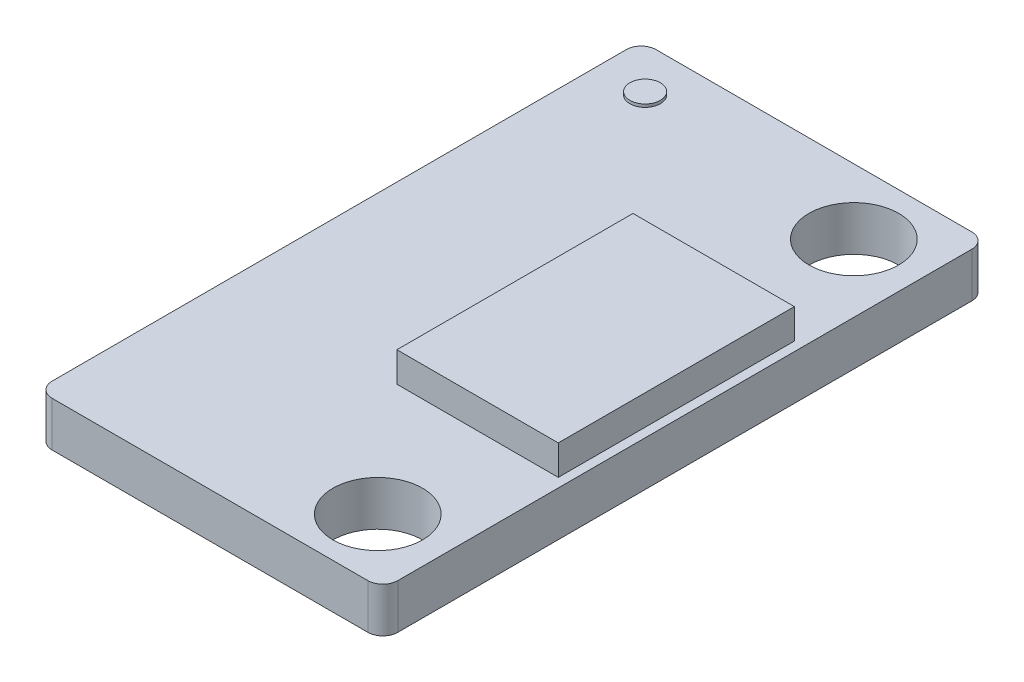
ISO-10303-21;
HEADER;
FILE_DESCRIPTION(('STEP AP214'),'2;1');
FILE_NAME('part.step','',(''),(''),'','','');
FILE_SCHEMA(('AUTOMOTIVE_DESIGN { 1 0 10303 214 1 1 1 1 }'));
ENDSEC;
DATA;
#1=APPLICATION_CONTEXT('core data for automotive mechanical design processes');
#2=APPLICATION_PROTOCOL_DEFINITION('international standard','automotive_design',2000,#1);
#3=PRODUCT_CONTEXT('',#1,'mechanical');
#4=PRODUCT('Part','Part','',(#3));
#5=PRODUCT_RELATED_PRODUCT_CATEGORY('part','',(#4));
#6=PRODUCT_DEFINITION_FORMATION('','',#4);
#7=PRODUCT_DEFINITION_CONTEXT('part definition',#1,'design');
#8=PRODUCT_DEFINITION('design','',#6,#7);
#9=PRODUCT_DEFINITION_SHAPE('','',#8);
#10=(LENGTH_UNIT() NAMED_UNIT(*) SI_UNIT(.MILLI.,.METRE.));
#11=(NAMED_UNIT(*) PLANE_ANGLE_UNIT() SI_UNIT($,.RADIAN.));
#12=(NAMED_UNIT(*) SI_UNIT($,.STERADIAN.) SOLID_ANGLE_UNIT());
#13=UNCERTAINTY_MEASURE_WITH_UNIT(LENGTH_MEASURE(1.E-05),#10,'distance_accuracy_value','');
#14=(GEOMETRIC_REPRESENTATION_CONTEXT(3) GLOBAL_UNCERTAINTY_ASSIGNED_CONTEXT((#13)) GLOBAL_UNIT_ASSIGNED_CONTEXT((#10,
#11,#12)) REPRESENTATION_CONTEXT('',''));
#15=CARTESIAN_POINT('',(0.,0.,0.));
#16=DIRECTION('',(0.,0.,1.));
#17=DIRECTION('',(1.,0.,0.));
#18=AXIS2_PLACEMENT_3D('',#15,#16,#17);
#19=CARTESIAN_POINT('',(-8.5603945745485,-1.5,-10.0844390445576));
#20=DIRECTION('',(-1.,0.,0.));
#21=DIRECTION('',(0.,0.,1.));
#22=AXIS2_PLACEMENT_3D('',#19,#20,#21);
#23=PLANE('',#22);
#24=DIRECTION('',(0.,0.,1.));
#25=VECTOR('',#24,1.);
#26=CARTESIAN_POINT('',(-8.5603945745485,0.,-10.0844390445576));
#27=LINE('',#26,#25);
#28=CARTESIAN_POINT('',(-8.5603945745485,0.,-9.58443904455764));
#29=VERTEX_POINT('',#28);
#30=CARTESIAN_POINT('',(-8.5603945745485,0.,9.62687746874085));
#31=VERTEX_POINT('',#30);
#32=EDGE_CURVE('E157',#29,#31,#27,.T.);
#33=ORIENTED_EDGE('',*,*,#32,.F.);
#34=DIRECTION('',(0.,1.,0.));
#35=VECTOR('',#34,1.);
#36=CARTESIAN_POINT('',(-8.5603945745485,-1.5,-9.58443904455764));
#37=LINE('',#36,#35);
#38=CARTESIAN_POINT('',(-8.5603945745485,-1.5,-9.58443904455764));
#39=VERTEX_POINT('',#38);
#40=EDGE_CURVE('E234',#29,#39,#37,.F.);
#41=ORIENTED_EDGE('',*,*,#40,.T.);
#42=DIRECTION('',(0.,0.,1.));
#43=VECTOR('',#42,1.);
#44=CARTESIAN_POINT('',(-8.5603945745485,-1.5,-10.0844390445576));
#45=LINE('',#44,#43);
#46=CARTESIAN_POINT('',(-8.5603945745485,-1.5,9.62687746874085));
#47=VERTEX_POINT('',#46);
#48=EDGE_CURVE('E168',#39,#47,#45,.T.);
#49=ORIENTED_EDGE('',*,*,#48,.T.);
#50=DIRECTION('',(0.,1.,0.));
#51=VECTOR('',#50,1.);
#52=CARTESIAN_POINT('',(-8.5603945745485,-1.5,9.62687746874085));
#53=LINE('',#52,#51);
#54=EDGE_CURVE('E230',#47,#31,#53,.T.);
#55=ORIENTED_EDGE('',*,*,#54,.T.);
#56=EDGE_LOOP('',(#33,#41,#49,#55));
#57=FACE_BOUND('',#56,.T.);
#58=ADVANCED_FACE('F38',(#57),#23,.T.);
#59=CARTESIAN_POINT('',(-8.5603945745485,-1.5,-10.0844390445576));
#60=DIRECTION('',(0.,0.,1.));
#61=DIRECTION('',(1.,0.,0.));
#62=AXIS2_PLACEMENT_3D('',#59,#60,#61);
#63=PLANE('',#62);
#64=DIRECTION('',(1.,0.,0.));
#65=VECTOR('',#64,1.);
#66=CARTESIAN_POINT('',(-8.5603945745485,0.,-10.0844390445576));
#67=LINE('',#66,#65);
#68=CARTESIAN_POINT('',(-8.0603945745485,0.,-10.0844390445576));
#69=VERTEX_POINT('',#68);
#70=CARTESIAN_POINT('',(2.50596611917854,0.,-10.0844390445576));
#71=VERTEX_POINT('',#70);
#72=EDGE_CURVE('E173',#69,#71,#67,.T.);
#73=ORIENTED_EDGE('',*,*,#72,.T.);
#74=DIRECTION('',(0.,1.,0.));
#75=VECTOR('',#74,1.);
#76=CARTESIAN_POINT('',(2.50596611917854,-1.5,-10.0844390445576));
#77=LINE('',#76,#75);
#78=CARTESIAN_POINT('',(2.50596611917854,-1.5,-10.0844390445576));
#79=VERTEX_POINT('',#78);
#80=EDGE_CURVE('E216',#71,#79,#77,.F.);
#81=ORIENTED_EDGE('',*,*,#80,.T.);
#82=DIRECTION('',(1.,0.,0.));
#83=VECTOR('',#82,1.);
#84=CARTESIAN_POINT('',(-8.5603945745485,-1.5,-10.0844390445576));
#85=LINE('',#84,#83);
#86=CARTESIAN_POINT('',(-8.0603945745485,-1.5,-10.0844390445576));
#87=VERTEX_POINT('',#86);
#88=EDGE_CURVE('E179',#87,#79,#85,.T.);
#89=ORIENTED_EDGE('',*,*,#88,.F.);
#90=DIRECTION('',(0.,1.,0.));
#91=VECTOR('',#90,1.);
#92=CARTESIAN_POINT('',(-8.0603945745485,0.,-10.0844390445576));
#93=LINE('',#92,#91);
#94=EDGE_CURVE('E212',#87,#69,#93,.T.);
#95=ORIENTED_EDGE('',*,*,#94,.T.);
#96=EDGE_LOOP('',(#73,#81,#89,#95));
#97=FACE_BOUND('',#96,.T.);
#98=ADVANCED_FACE('F260',(#97),#63,.F.);
#99=CARTESIAN_POINT('',(3.00596611917854,-1.5,-10.0844390445576));
#100=DIRECTION('',(-1.,0.,0.));
#101=DIRECTION('',(0.,0.,1.));
#102=AXIS2_PLACEMENT_3D('',#99,#100,#101);
#103=PLANE('',#102);
#104=DIRECTION('',(0.,0.,1.));
#105=VECTOR('',#104,1.);
#106=CARTESIAN_POINT('',(3.00596611917854,-1.5,-10.0844390445576));
#107=LINE('',#106,#105);
#108=CARTESIAN_POINT('',(3.00596611917854,-1.5,-9.58443904455764));
#109=VERTEX_POINT('',#108);
#110=CARTESIAN_POINT('',(3.00596611917854,-1.5,9.62687746874085));
#111=VERTEX_POINT('',#110);
#112=EDGE_CURVE('E176',#109,#111,#107,.T.);
#113=ORIENTED_EDGE('',*,*,#112,.F.);
#114=DIRECTION('',(0.,1.,0.));
#115=VECTOR('',#114,1.);
#116=CARTESIAN_POINT('',(3.00596611917854,-1.5,-9.58443904455764));
#117=LINE('',#116,#115);
#118=CARTESIAN_POINT('',(3.00596611917854,0.,-9.58443904455764));
#119=VERTEX_POINT('',#118);
#120=EDGE_CURVE('E196',#109,#119,#117,.T.);
#121=ORIENTED_EDGE('',*,*,#120,.T.);
#122=DIRECTION('',(0.,0.,1.));
#123=VECTOR('',#122,1.);
#124=CARTESIAN_POINT('',(3.00596611917854,0.,-10.0844390445576));
#125=LINE('',#124,#123);
#126=CARTESIAN_POINT('',(3.00596611917854,0.,9.62687746874085));
#127=VERTEX_POINT('',#126);
#128=EDGE_CURVE('E187',#119,#127,#125,.T.);
#129=ORIENTED_EDGE('',*,*,#128,.T.);
#130=DIRECTION('',(0.,1.,0.));
#131=VECTOR('',#130,1.);
#132=CARTESIAN_POINT('',(3.00596611917854,-1.5,9.62687746874085));
#133=LINE('',#132,#131);
#134=EDGE_CURVE('E182',#127,#111,#133,.F.);
#135=ORIENTED_EDGE('',*,*,#134,.T.);
#136=EDGE_LOOP('',(#113,#121,#129,#135));
#137=FACE_BOUND('',#136,.T.);
#138=ADVANCED_FACE('F268',(#137),#103,.F.);
#139=CARTESIAN_POINT('',(-8.5603945745485,-1.5,10.1268774687408));
#140=DIRECTION('',(0.,0.,1.));
#141=DIRECTION('',(1.,0.,0.));
#142=AXIS2_PLACEMENT_3D('',#139,#140,#141);
#143=PLANE('',#142);
#144=DIRECTION('',(1.,0.,0.));
#145=VECTOR('',#144,1.);
#146=CARTESIAN_POINT('',(-8.5603945745485,0.,10.1268774687408));
#147=LINE('',#146,#145);
#148=CARTESIAN_POINT('',(-8.0603945745485,0.,10.1268774687408));
#149=VERTEX_POINT('',#148);
#150=CARTESIAN_POINT('',(2.50596611917854,0.,10.1268774687408));
#151=VERTEX_POINT('',#150);
#152=EDGE_CURVE('E162',#149,#151,#147,.T.);
#153=ORIENTED_EDGE('',*,*,#152,.F.);
#154=DIRECTION('',(0.,1.,0.));
#155=VECTOR('',#154,1.);
#156=CARTESIAN_POINT('',(-8.0603945745485,-1.5,10.1268774687408));
#157=LINE('',#156,#155);
#158=CARTESIAN_POINT('',(-8.0603945745485,-1.5,10.1268774687408));
#159=VERTEX_POINT('',#158);
#160=EDGE_CURVE('E11',#149,#159,#157,.F.);
#161=ORIENTED_EDGE('',*,*,#160,.T.);
#162=DIRECTION('',(1.,0.,0.));
#163=VECTOR('',#162,1.);
#164=CARTESIAN_POINT('',(-8.5603945745485,-1.5,10.1268774687408));
#165=LINE('',#164,#163);
#166=CARTESIAN_POINT('',(2.50596611917854,-1.5,10.1268774687408));
#167=VERTEX_POINT('',#166);
#168=EDGE_CURVE('E172',#159,#167,#165,.T.);
#169=ORIENTED_EDGE('',*,*,#168,.T.);
#170=DIRECTION('',(0.,1.,0.));
#171=VECTOR('',#170,1.);
#172=CARTESIAN_POINT('',(2.50596611917854,0.,10.1268774687408));
#173=LINE('',#172,#171);
#174=EDGE_CURVE('E47',#167,#151,#173,.T.);
#175=ORIENTED_EDGE('',*,*,#174,.T.);
#176=EDGE_LOOP('',(#153,#161,#169,#175));
#177=FACE_BOUND('',#176,.T.);
#178=ADVANCED_FACE('F239',(#177),#143,.T.);
#179=CARTESIAN_POINT('',(0.,-1.5,0.));
#180=DIRECTION('',(0.,1.,0.));
#181=DIRECTION('',(0.,0.,1.));
#182=AXIS2_PLACEMENT_3D('',#179,#180,#181);
#183=PLANE('',#182);
#184=CARTESIAN_POINT('',(0.741742268013394,-1.5,-7.89949853589713));
#185=DIRECTION('',(0.,1.,0.));
#186=DIRECTION('',(0.,0.,1.));
#187=AXIS2_PLACEMENT_3D('',#184,#185,#186);
#188=CIRCLE('',#187,1.5);
#189=CARTESIAN_POINT('',(0.741742268013394,-1.5,-6.39949853589713));
#190=VERTEX_POINT('',#189);
#191=EDGE_CURVE('E437',#190,#190,#188,.T.);
#192=ORIENTED_EDGE('',*,*,#191,.T.);
#193=EDGE_LOOP('',(#192));
#194=FACE_BOUND('',#193,.T.);
#195=CARTESIAN_POINT('',(0.741742268013394,-1.5,8.03285957816409));
#196=DIRECTION('',(0.,1.,0.));
#197=DIRECTION('',(0.,0.,1.));
#198=AXIS2_PLACEMENT_3D('',#195,#196,#197);
#199=CIRCLE('',#198,1.5);
#200=CARTESIAN_POINT('',(0.741742268013394,-1.5,9.53285957816409));
#201=VERTEX_POINT('',#200);
#202=EDGE_CURVE('E440',#201,#201,#199,.T.);
#203=ORIENTED_EDGE('',*,*,#202,.T.);
#204=EDGE_LOOP('',(#203));
#205=FACE_BOUND('',#204,.T.);
#206=ORIENTED_EDGE('',*,*,#88,.T.);
#207=CARTESIAN_POINT('',(2.50596611917854,-1.5,-9.58443904455764));
#208=DIRECTION('',(0.,1.,0.));
#209=DIRECTION('',(0.,0.,1.));
#210=AXIS2_PLACEMENT_3D('',#207,#208,#209);
#211=CIRCLE('',#210,0.5);
#212=EDGE_CURVE('E227',#79,#109,#211,.F.);
#213=ORIENTED_EDGE('',*,*,#212,.T.);
#214=ORIENTED_EDGE('',*,*,#112,.T.);
#215=CARTESIAN_POINT('',(2.50596611917854,-1.5,9.62687746874085));
#216=DIRECTION('',(0.,1.,0.));
#217=DIRECTION('',(0.,0.,1.));
#218=AXIS2_PLACEMENT_3D('',#215,#216,#217);
#219=CIRCLE('',#218,0.5);
#220=EDGE_CURVE('E54',#111,#167,#219,.F.);
#221=ORIENTED_EDGE('',*,*,#220,.T.);
#222=ORIENTED_EDGE('',*,*,#168,.F.);
#223=CARTESIAN_POINT('',(-8.0603945745485,-1.5,9.62687746874085));
#224=DIRECTION('',(0.,1.,0.));
#225=DIRECTION('',(0.,0.,1.));
#226=AXIS2_PLACEMENT_3D('',#223,#224,#225);
#227=CIRCLE('',#226,0.5);
#228=EDGE_CURVE('E221',#159,#47,#227,.F.);
#229=ORIENTED_EDGE('',*,*,#228,.T.);
#230=ORIENTED_EDGE('',*,*,#48,.F.);
#231=CARTESIAN_POINT('',(-8.0603945745485,-1.5,-9.58443904455764));
#232=DIRECTION('',(0.,1.,0.));
#233=DIRECTION('',(0.,0.,1.));
#234=AXIS2_PLACEMENT_3D('',#231,#232,#233);
#235=CIRCLE('',#234,0.5);
#236=EDGE_CURVE('E224',#39,#87,#235,.F.);
#237=ORIENTED_EDGE('',*,*,#236,.T.);
#238=EDGE_LOOP('',(#206,#213,#214,#221,#222,#229,#230,#237));
#239=FACE_BOUND('',#238,.T.);
#240=ADVANCED_FACE('F253',(#194,#205,#239),#183,.F.);
#241=CARTESIAN_POINT('',(0.,0.,0.));
#242=DIRECTION('',(0.,1.,0.));
#243=DIRECTION('',(0.,0.,1.));
#244=AXIS2_PLACEMENT_3D('',#241,#242,#243);
#245=PLANE('',#244);
#246=CARTESIAN_POINT('',(0.741742268013394,0.,-7.89949853589713));
#247=DIRECTION('',(0.,1.,0.));
#248=DIRECTION('',(0.,0.,1.));
#249=AXIS2_PLACEMENT_3D('',#246,#247,#248);
#250=CIRCLE('',#249,1.5);
#251=CARTESIAN_POINT('',(0.741742268013394,0.,-6.39949853589713));
#252=VERTEX_POINT('',#251);
#253=EDGE_CURVE('E443',#252,#252,#250,.T.);
#254=ORIENTED_EDGE('',*,*,#253,.F.);
#255=EDGE_LOOP('',(#254));
#256=FACE_BOUND('',#255,.T.);
#257=CARTESIAN_POINT('',(0.741742268013394,0.,8.03285957816409));
#258=DIRECTION('',(0.,1.,0.));
#259=DIRECTION('',(0.,0.,1.));
#260=AXIS2_PLACEMENT_3D('',#257,#258,#259);
#261=CIRCLE('',#260,1.5);
#262=CARTESIAN_POINT('',(0.741742268013394,0.,9.53285957816409));
#263=VERTEX_POINT('',#262);
#264=EDGE_CURVE('E450',#263,#263,#261,.T.);
#265=ORIENTED_EDGE('',*,*,#264,.F.);
#266=EDGE_LOOP('',(#265));
#267=FACE_BOUND('',#266,.T.);
#268=CARTESIAN_POINT('',(-6.93011195325359,0.,-8.5863892127535));
#269=DIRECTION('',(0.,1.,0.));
#270=DIRECTION('',(0.,0.,1.));
#271=AXIS2_PLACEMENT_3D('',#268,#269,#270);
#272=CIRCLE('',#271,0.51);
#273=CARTESIAN_POINT('',(-6.93011195325359,0.,-8.0763892127535));
#274=VERTEX_POINT('',#273);
#275=EDGE_CURVE('E447',#274,#274,#272,.T.);
#276=ORIENTED_EDGE('',*,*,#275,.F.);
#277=EDGE_LOOP('',(#276));
#278=FACE_BOUND('',#277,.T.);
#279=DIRECTION('',(0.,0.,1.));
#280=VECTOR('',#279,1.);
#281=CARTESIAN_POINT('',(-2.7,0.,-3.95));
#282=LINE('',#281,#280);
#283=CARTESIAN_POINT('',(-2.7,0.,-3.95));
#284=VERTEX_POINT('',#283);
#285=CARTESIAN_POINT('',(-2.7,0.,3.95));
#286=VERTEX_POINT('',#285);
#287=EDGE_CURVE('E155',#284,#286,#282,.T.);
#288=ORIENTED_EDGE('',*,*,#287,.F.);
#289=DIRECTION('',(1.,0.,0.));
#290=VECTOR('',#289,1.);
#291=CARTESIAN_POINT('',(-2.7,0.,-3.95));
#292=LINE('',#291,#290);
#293=CARTESIAN_POINT('',(2.7,0.,-3.95));
#294=VERTEX_POINT('',#293);
#295=EDGE_CURVE('E152',#284,#294,#292,.T.);
#296=ORIENTED_EDGE('',*,*,#295,.T.);
#297=DIRECTION('',(0.,0.,1.));
#298=VECTOR('',#297,1.);
#299=CARTESIAN_POINT('',(2.7,0.,-3.95));
#300=LINE('',#299,#298);
#301=CARTESIAN_POINT('',(2.7,0.,3.95));
#302=VERTEX_POINT('',#301);
#303=EDGE_CURVE('E471',#294,#302,#300,.T.);
#304=ORIENTED_EDGE('',*,*,#303,.T.);
#305=DIRECTION('',(1.,0.,0.));
#306=VECTOR('',#305,1.);
#307=CARTESIAN_POINT('',(-2.7,0.,3.95));
#308=LINE('',#307,#306);
#309=EDGE_CURVE('E468',#286,#302,#308,.T.);
#310=ORIENTED_EDGE('',*,*,#309,.F.);
#311=EDGE_LOOP('',(#288,#296,#304,#310));
#312=FACE_BOUND('',#311,.T.);
#313=ORIENTED_EDGE('',*,*,#128,.F.);
#314=CARTESIAN_POINT('',(2.50596611917854,0.,-9.58443904455764));
#315=DIRECTION('',(0.,1.,0.));
#316=DIRECTION('',(0.,0.,1.));
#317=AXIS2_PLACEMENT_3D('',#314,#315,#316);
#318=CIRCLE('',#317,0.5);
#319=EDGE_CURVE('E209',#119,#71,#318,.T.);
#320=ORIENTED_EDGE('',*,*,#319,.T.);
#321=ORIENTED_EDGE('',*,*,#72,.F.);
#322=CARTESIAN_POINT('',(-8.0603945745485,0.,-9.58443904455764));
#323=DIRECTION('',(0.,1.,0.));
#324=DIRECTION('',(0.,0.,1.));
#325=AXIS2_PLACEMENT_3D('',#322,#323,#324);
#326=CIRCLE('',#325,0.5);
#327=EDGE_CURVE('E206',#69,#29,#326,.T.);
#328=ORIENTED_EDGE('',*,*,#327,.T.);
#329=ORIENTED_EDGE('',*,*,#32,.T.);
#330=CARTESIAN_POINT('',(-8.0603945745485,0.,9.62687746874085));
#331=DIRECTION('',(0.,1.,0.));
#332=DIRECTION('',(0.,0.,1.));
#333=AXIS2_PLACEMENT_3D('',#330,#331,#332);
#334=CIRCLE('',#333,0.5);
#335=EDGE_CURVE('E203',#31,#149,#334,.T.);
#336=ORIENTED_EDGE('',*,*,#335,.T.);
#337=ORIENTED_EDGE('',*,*,#152,.T.);
#338=CARTESIAN_POINT('',(2.50596611917854,0.,9.62687746874085));
#339=DIRECTION('',(0.,1.,0.));
#340=DIRECTION('',(0.,0.,1.));
#341=AXIS2_PLACEMENT_3D('',#338,#339,#340);
#342=CIRCLE('',#341,0.5);
#343=EDGE_CURVE('E200',#151,#127,#342,.T.);
#344=ORIENTED_EDGE('',*,*,#343,.T.);
#345=EDGE_LOOP('',(#313,#320,#321,#328,#329,#336,#337,#344));
#346=FACE_BOUND('',#345,.T.);
#347=ADVANCED_FACE('F243',(#256,#267,#278,#312,#346),#245,.T.);
#348=CARTESIAN_POINT('',(-2.7,1.,-3.95));
#349=DIRECTION('',(1.,0.,0.));
#350=DIRECTION('',(0.,0.,-1.));
#351=AXIS2_PLACEMENT_3D('',#348,#349,#350);
#352=PLANE('',#351);
#353=ORIENTED_EDGE('',*,*,#287,.T.);
#354=DIRECTION('',(0.,-1.,0.));
#355=VECTOR('',#354,1.);
#356=CARTESIAN_POINT('',(-2.7,1.,3.95));
#357=LINE('',#356,#355);
#358=CARTESIAN_POINT('',(-2.7,1.,3.95));
#359=VERTEX_POINT('',#358);
#360=EDGE_CURVE('E133',#359,#286,#357,.T.);
#361=ORIENTED_EDGE('',*,*,#360,.F.);
#362=DIRECTION('',(0.,0.,1.));
#363=VECTOR('',#362,1.);
#364=CARTESIAN_POINT('',(-2.7,1.,-3.95));
#365=LINE('',#364,#363);
#366=CARTESIAN_POINT('',(-2.7,1.,-3.95));
#367=VERTEX_POINT('',#366);
#368=EDGE_CURVE('E142',#367,#359,#365,.T.);
#369=ORIENTED_EDGE('',*,*,#368,.F.);
#370=DIRECTION('',(0.,-1.,0.));
#371=VECTOR('',#370,1.);
#372=CARTESIAN_POINT('',(-2.7,1.,-3.95));
#373=LINE('',#372,#371);
#374=EDGE_CURVE('E465',#367,#284,#373,.T.);
#375=ORIENTED_EDGE('',*,*,#374,.T.);
#376=EDGE_LOOP('',(#353,#361,#369,#375));
#377=FACE_BOUND('',#376,.T.);
#378=ADVANCED_FACE('F154',(#377),#352,.F.);
#379=CARTESIAN_POINT('',(-2.7,1.,3.95));
#380=DIRECTION('',(0.,0.,-1.));
#381=DIRECTION('',(-1.,0.,0.));
#382=AXIS2_PLACEMENT_3D('',#379,#380,#381);
#383=PLANE('',#382);
#384=ORIENTED_EDGE('',*,*,#309,.T.);
#385=DIRECTION('',(0.,-1.,0.));
#386=VECTOR('',#385,1.);
#387=CARTESIAN_POINT('',(2.7,1.,3.95));
#388=LINE('',#387,#386);
#389=CARTESIAN_POINT('',(2.7,1.,3.95));
#390=VERTEX_POINT('',#389);
#391=EDGE_CURVE('E136',#390,#302,#388,.T.);
#392=ORIENTED_EDGE('',*,*,#391,.F.);
#393=DIRECTION('',(1.,0.,0.));
#394=VECTOR('',#393,1.);
#395=CARTESIAN_POINT('',(-2.7,1.,3.95));
#396=LINE('',#395,#394);
#397=EDGE_CURVE('E128',#359,#390,#396,.T.);
#398=ORIENTED_EDGE('',*,*,#397,.F.);
#399=ORIENTED_EDGE('',*,*,#360,.T.);
#400=EDGE_LOOP('',(#384,#392,#398,#399));
#401=FACE_BOUND('',#400,.T.);
#402=ADVANCED_FACE('F131',(#401),#383,.F.);
#403=CARTESIAN_POINT('',(2.7,1.,-3.95));
#404=DIRECTION('',(1.,0.,0.));
#405=DIRECTION('',(0.,0.,-1.));
#406=AXIS2_PLACEMENT_3D('',#403,#404,#405);
#407=PLANE('',#406);
#408=ORIENTED_EDGE('',*,*,#303,.F.);
#409=DIRECTION('',(0.,-1.,0.));
#410=VECTOR('',#409,1.);
#411=CARTESIAN_POINT('',(2.7,1.,-3.95));
#412=LINE('',#411,#410);
#413=CARTESIAN_POINT('',(2.7,1.,-3.95));
#414=VERTEX_POINT('',#413);
#415=EDGE_CURVE('E164',#414,#294,#412,.T.);
#416=ORIENTED_EDGE('',*,*,#415,.F.);
#417=DIRECTION('',(0.,0.,1.));
#418=VECTOR('',#417,1.);
#419=CARTESIAN_POINT('',(2.7,1.,-3.95));
#420=LINE('',#419,#418);
#421=EDGE_CURVE('E141',#414,#390,#420,.T.);
#422=ORIENTED_EDGE('',*,*,#421,.T.);
#423=ORIENTED_EDGE('',*,*,#391,.T.);
#424=EDGE_LOOP('',(#408,#416,#422,#423));
#425=FACE_BOUND('',#424,.T.);
#426=ADVANCED_FACE('F359',(#425),#407,.T.);
#427=CARTESIAN_POINT('',(-2.7,1.,-3.95));
#428=DIRECTION('',(0.,0.,-1.));
#429=DIRECTION('',(-1.,0.,0.));
#430=AXIS2_PLACEMENT_3D('',#427,#428,#429);
#431=PLANE('',#430);
#432=ORIENTED_EDGE('',*,*,#295,.F.);
#433=ORIENTED_EDGE('',*,*,#374,.F.);
#434=DIRECTION('',(1.,0.,0.));
#435=VECTOR('',#434,1.);
#436=CARTESIAN_POINT('',(-2.7,1.,-3.95));
#437=LINE('',#436,#435);
#438=EDGE_CURVE('E148',#367,#414,#437,.T.);
#439=ORIENTED_EDGE('',*,*,#438,.T.);
#440=ORIENTED_EDGE('',*,*,#415,.T.);
#441=EDGE_LOOP('',(#432,#433,#439,#440));
#442=FACE_BOUND('',#441,.T.);
#443=ADVANCED_FACE('F351',(#442),#431,.T.);
#444=CARTESIAN_POINT('',(0.,1.,0.));
#445=DIRECTION('',(0.,1.,0.));
#446=DIRECTION('',(0.,0.,1.));
#447=AXIS2_PLACEMENT_3D('',#444,#445,#446);
#448=PLANE('',#447);
#449=ORIENTED_EDGE('',*,*,#368,.T.);
#450=ORIENTED_EDGE('',*,*,#397,.T.);
#451=ORIENTED_EDGE('',*,*,#421,.F.);
#452=ORIENTED_EDGE('',*,*,#438,.F.);
#453=EDGE_LOOP('',(#449,#450,#451,#452));
#454=FACE_BOUND('',#453,.T.);
#455=ADVANCED_FACE('F146',(#454),#448,.T.);
#456=CARTESIAN_POINT('',(-6.93011195325359,0.1,-8.5863892127535));
#457=DIRECTION('',(0.,-1.,0.));
#458=DIRECTION('',(0.,0.,-1.));
#459=AXIS2_PLACEMENT_3D('',#456,#457,#458);
#460=CYLINDRICAL_SURFACE('',#459,0.51);
#461=CARTESIAN_POINT('',(-6.93011195325359,0.1,-8.5863892127535));
#462=DIRECTION('',(0.,1.,0.));
#463=DIRECTION('',(0.,0.,1.));
#464=AXIS2_PLACEMENT_3D('',#461,#462,#463);
#465=CIRCLE('',#464,0.51);
#466=CARTESIAN_POINT('',(-6.93011195325359,0.1,-8.0763892127535));
#467=VERTEX_POINT('',#466);
#468=EDGE_CURVE('E454',#467,#467,#465,.T.);
#469=ORIENTED_EDGE('',*,*,#468,.F.);
#470=EDGE_LOOP('',(#469));
#471=FACE_BOUND('',#470,.T.);
#472=ORIENTED_EDGE('',*,*,#275,.T.);
#473=EDGE_LOOP('',(#472));
#474=FACE_BOUND('',#473,.T.);
#475=ADVANCED_FACE('F334',(#471,#474),#460,.T.);
#476=CARTESIAN_POINT('',(-6.93011195325359,0.1,-8.5863892127535));
#477=DIRECTION('',(0.,1.,0.));
#478=DIRECTION('',(0.,0.,1.));
#479=AXIS2_PLACEMENT_3D('',#476,#477,#478);
#480=PLANE('',#479);
#481=ORIENTED_EDGE('',*,*,#468,.T.);
#482=EDGE_LOOP('',(#481));
#483=FACE_BOUND('',#482,.T.);
#484=ADVANCED_FACE('F325',(#483),#480,.T.);
#485=CARTESIAN_POINT('',(0.741742268013394,-2.1,8.03285957816409));
#486=DIRECTION('',(0.,1.,0.));
#487=DIRECTION('',(0.,0.,1.));
#488=AXIS2_PLACEMENT_3D('',#485,#486,#487);
#489=CYLINDRICAL_SURFACE('',#488,1.5);
#490=ORIENTED_EDGE('',*,*,#264,.T.);
#491=EDGE_LOOP('',(#490));
#492=FACE_BOUND('',#491,.T.);
#493=ORIENTED_EDGE('',*,*,#202,.F.);
#494=EDGE_LOOP('',(#493));
#495=FACE_BOUND('',#494,.T.);
#496=ADVANCED_FACE('F316',(#492,#495),#489,.F.);
#497=CARTESIAN_POINT('',(0.741742268013394,-2.1,-7.89949853589713));
#498=DIRECTION('',(0.,1.,0.));
#499=DIRECTION('',(0.,0.,1.));
#500=AXIS2_PLACEMENT_3D('',#497,#498,#499);
#501=CYLINDRICAL_SURFACE('',#500,1.5);
#502=ORIENTED_EDGE('',*,*,#253,.T.);
#503=EDGE_LOOP('',(#502));
#504=FACE_BOUND('',#503,.T.);
#505=ORIENTED_EDGE('',*,*,#191,.F.);
#506=EDGE_LOOP('',(#505));
#507=FACE_BOUND('',#506,.T.);
#508=ADVANCED_FACE('F285',(#504,#507),#501,.F.);
#509=CARTESIAN_POINT('',(2.50596611917854,-1.5,-9.58443904455764));
#510=DIRECTION('',(0.,1.,0.));
#511=DIRECTION('',(0.,0.,1.));
#512=AXIS2_PLACEMENT_3D('',#509,#510,#511);
#513=CYLINDRICAL_SURFACE('',#512,0.5);
#514=ORIENTED_EDGE('',*,*,#212,.F.);
#515=ORIENTED_EDGE('',*,*,#80,.F.);
#516=ORIENTED_EDGE('',*,*,#319,.F.);
#517=ORIENTED_EDGE('',*,*,#120,.F.);
#518=EDGE_LOOP('',(#514,#515,#516,#517));
#519=FACE_BOUND('',#518,.T.);
#520=ADVANCED_FACE('F265',(#519),#513,.T.);
#521=CARTESIAN_POINT('',(-8.0603945745485,-1.5,-9.58443904455764));
#522=DIRECTION('',(0.,-1.,0.));
#523=DIRECTION('',(0.,0.,-1.));
#524=AXIS2_PLACEMENT_3D('',#521,#522,#523);
#525=CYLINDRICAL_SURFACE('',#524,0.5);
#526=ORIENTED_EDGE('',*,*,#236,.F.);
#527=ORIENTED_EDGE('',*,*,#40,.F.);
#528=ORIENTED_EDGE('',*,*,#327,.F.);
#529=ORIENTED_EDGE('',*,*,#94,.F.);
#530=EDGE_LOOP('',(#526,#527,#528,#529));
#531=FACE_BOUND('',#530,.T.);
#532=ADVANCED_FACE('F257',(#531),#525,.T.);
#533=CARTESIAN_POINT('',(-8.0603945745485,-1.5,9.62687746874085));
#534=DIRECTION('',(0.,1.,0.));
#535=DIRECTION('',(0.,0.,1.));
#536=AXIS2_PLACEMENT_3D('',#533,#534,#535);
#537=CYLINDRICAL_SURFACE('',#536,0.5);
#538=ORIENTED_EDGE('',*,*,#228,.F.);
#539=ORIENTED_EDGE('',*,*,#160,.F.);
#540=ORIENTED_EDGE('',*,*,#335,.F.);
#541=ORIENTED_EDGE('',*,*,#54,.F.);
#542=EDGE_LOOP('',(#538,#539,#540,#541));
#543=FACE_BOUND('',#542,.T.);
#544=ADVANCED_FACE('F248',(#543),#537,.T.);
#545=CARTESIAN_POINT('',(2.50596611917854,-1.5,9.62687746874085));
#546=DIRECTION('',(0.,-1.,0.));
#547=DIRECTION('',(0.,0.,-1.));
#548=AXIS2_PLACEMENT_3D('',#545,#546,#547);
#549=CYLINDRICAL_SURFACE('',#548,0.5);
#550=ORIENTED_EDGE('',*,*,#220,.F.);
#551=ORIENTED_EDGE('',*,*,#134,.F.);
#552=ORIENTED_EDGE('',*,*,#343,.F.);
#553=ORIENTED_EDGE('',*,*,#174,.F.);
#554=EDGE_LOOP('',(#550,#551,#552,#553));
#555=FACE_BOUND('',#554,.T.);
#556=ADVANCED_FACE('F40',(#555),#549,.T.);
#557=CLOSED_SHELL('',(#58,#98,#138,#178,#240,#347,#378,#402,#426,#443,#455,#475,#484,#496,#508,
#520,#532,#544,#556));
#558=MANIFOLD_SOLID_BREP('B2',#557);
#559=ADVANCED_BREP_SHAPE_REPRESENTATION('',(#18,#558),#14);
#560=SHAPE_DEFINITION_REPRESENTATION(#9,#559);
ENDSEC;
END-ISO-10303-21;
